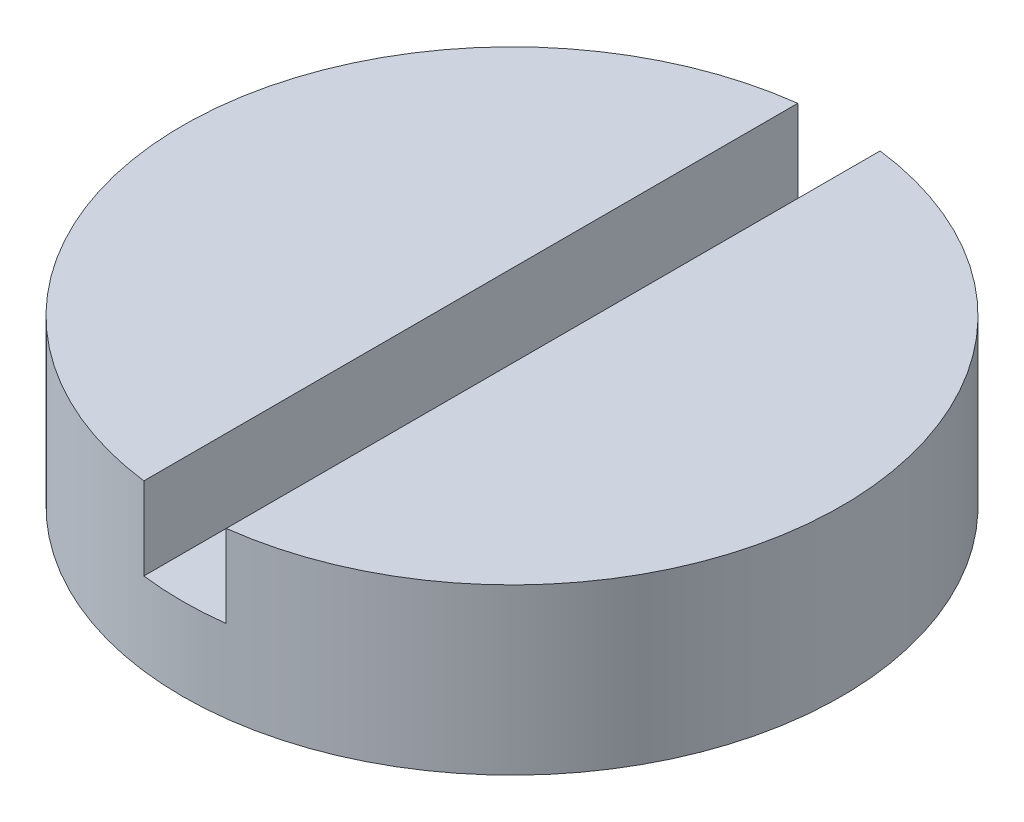
ISO-10303-21;
HEADER;
FILE_DESCRIPTION(('STEP AP214'),'2;1');
FILE_NAME('part.step','',(''),(''),'','','');
FILE_SCHEMA(('AUTOMOTIVE_DESIGN { 1 0 10303 214 1 1 1 1 }'));
ENDSEC;
DATA;
#1=APPLICATION_CONTEXT('core data for automotive mechanical design processes');
#2=APPLICATION_PROTOCOL_DEFINITION('international standard','automotive_design',2000,#1);
#3=PRODUCT_CONTEXT('',#1,'mechanical');
#4=PRODUCT('Part','Part','',(#3));
#5=PRODUCT_RELATED_PRODUCT_CATEGORY('part','',(#4));
#6=PRODUCT_DEFINITION_FORMATION('','',#4);
#7=PRODUCT_DEFINITION_CONTEXT('part definition',#1,'design');
#8=PRODUCT_DEFINITION('design','',#6,#7);
#9=PRODUCT_DEFINITION_SHAPE('','',#8);
#10=(LENGTH_UNIT() NAMED_UNIT(*) SI_UNIT(.MILLI.,.METRE.));
#11=(NAMED_UNIT(*) PLANE_ANGLE_UNIT() SI_UNIT($,.RADIAN.));
#12=(NAMED_UNIT(*) SI_UNIT($,.STERADIAN.) SOLID_ANGLE_UNIT());
#13=UNCERTAINTY_MEASURE_WITH_UNIT(LENGTH_MEASURE(1.E-05),#10,'distance_accuracy_value','');
#14=(GEOMETRIC_REPRESENTATION_CONTEXT(3) GLOBAL_UNCERTAINTY_ASSIGNED_CONTEXT((#13)) GLOBAL_UNIT_ASSIGNED_CONTEXT((#10,
#11,#12)) REPRESENTATION_CONTEXT('',''));
#15=CARTESIAN_POINT('',(0.,0.,0.));
#16=DIRECTION('',(0.,0.,1.));
#17=DIRECTION('',(1.,0.,0.));
#18=AXIS2_PLACEMENT_3D('',#15,#16,#17);
#19=CARTESIAN_POINT('',(0.,2.,0.));
#20=DIRECTION('',(0.,1.,0.));
#21=DIRECTION('',(0.,0.,1.));
#22=AXIS2_PLACEMENT_3D('',#19,#20,#21);
#23=PLANE('',#22);
#24=DIRECTION('',(0.,0.,-1.));
#25=VECTOR('',#24,1.);
#26=CARTESIAN_POINT('',(0.500000000000001,2.,-3.96862696659689));
#27=LINE('',#26,#25);
#28=CARTESIAN_POINT('',(0.5,2.,3.96862696659689));
#29=VERTEX_POINT('',#28);
#30=CARTESIAN_POINT('',(0.500000000000001,2.,-3.96862696659689));
#31=VERTEX_POINT('',#30);
#32=EDGE_CURVE('E74',#29,#31,#27,.T.);
#33=ORIENTED_EDGE('',*,*,#32,.F.);
#34=CARTESIAN_POINT('',(0.,2.,0.));
#35=DIRECTION('',(0.,1.,0.));
#36=DIRECTION('',(0.,0.,1.));
#37=AXIS2_PLACEMENT_3D('',#34,#35,#36);
#38=CIRCLE('',#37,4.);
#39=EDGE_CURVE('E11',#29,#31,#38,.T.);
#40=ORIENTED_EDGE('',*,*,#39,.T.);
#41=EDGE_LOOP('',(#33,#40));
#42=FACE_BOUND('',#41,.T.);
#43=ADVANCED_FACE('F35',(#42),#23,.T.);
#44=CARTESIAN_POINT('',(0.,2.,0.));
#45=DIRECTION('',(0.,-1.,0.));
#46=DIRECTION('',(0.,0.,-1.));
#47=AXIS2_PLACEMENT_3D('',#44,#45,#46);
#48=CYLINDRICAL_SURFACE('',#47,4.);
#49=CARTESIAN_POINT('',(0.,1.,0.));
#50=DIRECTION('',(0.,1.,0.));
#51=DIRECTION('',(0.,0.,1.));
#52=AXIS2_PLACEMENT_3D('',#49,#50,#51);
#53=CIRCLE('',#52,4.);
#54=CARTESIAN_POINT('',(0.500000000000001,1.,-3.96862696659689));
#55=VERTEX_POINT('',#54);
#56=CARTESIAN_POINT('',(-0.499999999999999,1.,-3.96862696659689));
#57=VERTEX_POINT('',#56);
#58=EDGE_CURVE('E94',#55,#57,#53,.T.);
#59=ORIENTED_EDGE('',*,*,#58,.F.);
#60=DIRECTION('',(0.,1.,0.));
#61=VECTOR('',#60,1.);
#62=CARTESIAN_POINT('',(0.500000000000001,1.,-3.96862696659689));
#63=LINE('',#62,#61);
#64=EDGE_CURVE('E60',#55,#31,#63,.T.);
#65=ORIENTED_EDGE('',*,*,#64,.T.);
#66=ORIENTED_EDGE('',*,*,#39,.F.);
#67=DIRECTION('',(0.,1.,0.));
#68=VECTOR('',#67,1.);
#69=CARTESIAN_POINT('',(0.5,1.,3.96862696659689));
#70=LINE('',#69,#68);
#71=CARTESIAN_POINT('',(0.5,1.,3.96862696659689));
#72=VERTEX_POINT('',#71);
#73=EDGE_CURVE('E88',#72,#29,#70,.T.);
#74=ORIENTED_EDGE('',*,*,#73,.F.);
#75=CARTESIAN_POINT('',(0.,1.,0.));
#76=DIRECTION('',(0.,1.,0.));
#77=DIRECTION('',(0.,0.,1.));
#78=AXIS2_PLACEMENT_3D('',#75,#76,#77);
#79=CIRCLE('',#78,4.);
#80=CARTESIAN_POINT('',(-0.499999999999999,1.,3.96862696659689));
#81=VERTEX_POINT('',#80);
#82=EDGE_CURVE('E92',#81,#72,#79,.T.);
#83=ORIENTED_EDGE('',*,*,#82,.F.);
#84=DIRECTION('',(0.,1.,0.));
#85=VECTOR('',#84,1.);
#86=CARTESIAN_POINT('',(-0.499999999999999,1.,3.96862696659689));
#87=LINE('',#86,#85);
#88=CARTESIAN_POINT('',(-0.499999999999999,2.,3.96862696659689));
#89=VERTEX_POINT('',#88);
#90=EDGE_CURVE('E81',#81,#89,#87,.T.);
#91=ORIENTED_EDGE('',*,*,#90,.T.);
#92=CARTESIAN_POINT('',(-0.499999999999999,2.,-3.96862696659689));
#93=VERTEX_POINT('',#92);
#94=EDGE_CURVE('E44',#93,#89,#38,.T.);
#95=ORIENTED_EDGE('',*,*,#94,.F.);
#96=DIRECTION('',(0.,1.,0.));
#97=VECTOR('',#96,1.);
#98=CARTESIAN_POINT('',(-0.499999999999999,1.,-3.96862696659689));
#99=LINE('',#98,#97);
#100=EDGE_CURVE('E51',#57,#93,#99,.T.);
#101=ORIENTED_EDGE('',*,*,#100,.F.);
#102=EDGE_LOOP('',(#59,#65,#66,#74,#83,#91,#95,#101));
#103=FACE_BOUND('',#102,.T.);
#104=CARTESIAN_POINT('',(0.,0.,0.));
#105=DIRECTION('',(0.,1.,0.));
#106=DIRECTION('',(0.,0.,1.));
#107=AXIS2_PLACEMENT_3D('',#104,#105,#106);
#108=CIRCLE('',#107,4.);
#109=CARTESIAN_POINT('',(0.,0.,4.));
#110=VERTEX_POINT('',#109);
#111=EDGE_CURVE('E39',#110,#110,#108,.T.);
#112=ORIENTED_EDGE('',*,*,#111,.T.);
#113=EDGE_LOOP('',(#112));
#114=FACE_BOUND('',#113,.T.);
#115=ADVANCED_FACE('F37',(#103,#114),#48,.T.);
#116=DIRECTION('',(0.,0.,1.));
#117=VECTOR('',#116,1.);
#118=CARTESIAN_POINT('',(-0.499999999999999,2.,-3.96862696659689));
#119=LINE('',#118,#117);
#120=EDGE_CURVE('E83',#93,#89,#119,.T.);
#121=ORIENTED_EDGE('',*,*,#120,.F.);
#122=ORIENTED_EDGE('',*,*,#94,.T.);
#123=EDGE_LOOP('',(#121,#122));
#124=FACE_BOUND('',#123,.T.);
#125=ADVANCED_FACE('F116',(#124),#23,.T.);
#126=CARTESIAN_POINT('',(0.,0.,0.));
#127=DIRECTION('',(0.,1.,0.));
#128=DIRECTION('',(0.,0.,1.));
#129=AXIS2_PLACEMENT_3D('',#126,#127,#128);
#130=PLANE('',#129);
#131=ORIENTED_EDGE('',*,*,#111,.F.);
#132=EDGE_LOOP('',(#131));
#133=FACE_BOUND('',#132,.T.);
#134=ADVANCED_FACE('F114',(#133),#130,.F.);
#135=CARTESIAN_POINT('',(0.500000000000001,1.,-3.96862696659689));
#136=DIRECTION('',(1.,0.,0.));
#137=DIRECTION('',(0.,0.,-1.));
#138=AXIS2_PLACEMENT_3D('',#135,#136,#137);
#139=PLANE('',#138);
#140=ORIENTED_EDGE('',*,*,#32,.T.);
#141=ORIENTED_EDGE('',*,*,#64,.F.);
#142=DIRECTION('',(0.,0.,-1.));
#143=VECTOR('',#142,1.);
#144=CARTESIAN_POINT('',(0.500000000000001,1.,-3.96862696659689));
#145=LINE('',#144,#143);
#146=EDGE_CURVE('E99',#72,#55,#145,.T.);
#147=ORIENTED_EDGE('',*,*,#146,.F.);
#148=ORIENTED_EDGE('',*,*,#73,.T.);
#149=EDGE_LOOP('',(#140,#141,#147,#148));
#150=FACE_BOUND('',#149,.T.);
#151=ADVANCED_FACE('F108',(#150),#139,.F.);
#152=CARTESIAN_POINT('',(-0.499999999999999,1.,-3.96862696659689));
#153=DIRECTION('',(-1.,0.,0.));
#154=DIRECTION('',(0.,0.,1.));
#155=AXIS2_PLACEMENT_3D('',#152,#153,#154);
#156=PLANE('',#155);
#157=ORIENTED_EDGE('',*,*,#120,.T.);
#158=ORIENTED_EDGE('',*,*,#90,.F.);
#159=DIRECTION('',(0.,0.,1.));
#160=VECTOR('',#159,1.);
#161=CARTESIAN_POINT('',(-0.499999999999999,1.,-3.96862696659689));
#162=LINE('',#161,#160);
#163=EDGE_CURVE('E78',#57,#81,#162,.T.);
#164=ORIENTED_EDGE('',*,*,#163,.F.);
#165=ORIENTED_EDGE('',*,*,#100,.T.);
#166=EDGE_LOOP('',(#157,#158,#164,#165));
#167=FACE_BOUND('',#166,.T.);
#168=ADVANCED_FACE('F82',(#167),#156,.F.);
#169=CARTESIAN_POINT('',(0.,1.,0.));
#170=DIRECTION('',(0.,1.,0.));
#171=DIRECTION('',(0.,0.,1.));
#172=AXIS2_PLACEMENT_3D('',#169,#170,#171);
#173=PLANE('',#172);
#174=ORIENTED_EDGE('',*,*,#58,.T.);
#175=ORIENTED_EDGE('',*,*,#163,.T.);
#176=ORIENTED_EDGE('',*,*,#82,.T.);
#177=ORIENTED_EDGE('',*,*,#146,.T.);
#178=EDGE_LOOP('',(#174,#175,#176,#177));
#179=FACE_BOUND('',#178,.T.);
#180=ADVANCED_FACE('F91',(#179),#173,.T.);
#181=CLOSED_SHELL('',(#43,#115,#125,#134,#151,#168,#180));
#182=MANIFOLD_SOLID_BREP('B2',#181);
#183=ADVANCED_BREP_SHAPE_REPRESENTATION('',(#18,#182),#14);
#184=SHAPE_DEFINITION_REPRESENTATION(#9,#183);
ENDSEC;
END-ISO-10303-21;
